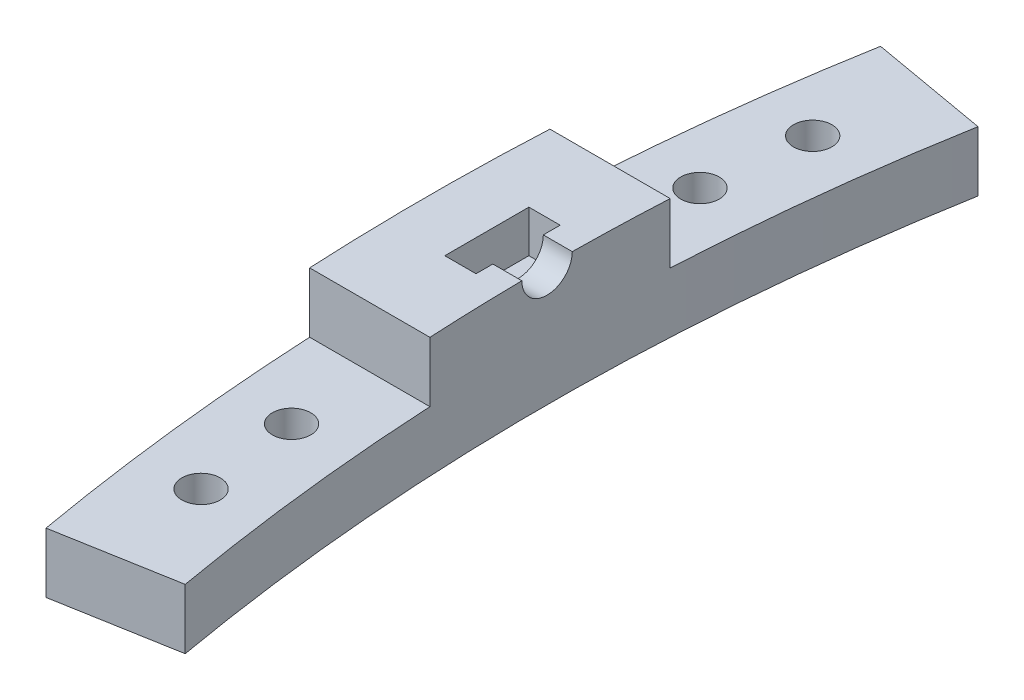
ISO-10303-21;
HEADER;
FILE_DESCRIPTION(('STEP AP214'),'2;1');
FILE_NAME('part.step','',(''),(''),'','','');
FILE_SCHEMA(('AUTOMOTIVE_DESIGN { 1 0 10303 214 1 1 1 1 }'));
ENDSEC;
DATA;
#1=APPLICATION_CONTEXT('core data for automotive mechanical design processes');
#2=APPLICATION_PROTOCOL_DEFINITION('international standard','automotive_design',2000,#1);
#3=PRODUCT_CONTEXT('',#1,'mechanical');
#4=PRODUCT('Part','Part','',(#3));
#5=PRODUCT_RELATED_PRODUCT_CATEGORY('part','',(#4));
#6=PRODUCT_DEFINITION_FORMATION('','',#4);
#7=PRODUCT_DEFINITION_CONTEXT('part definition',#1,'design');
#8=PRODUCT_DEFINITION('design','',#6,#7);
#9=PRODUCT_DEFINITION_SHAPE('','',#8);
#10=(LENGTH_UNIT() NAMED_UNIT(*) SI_UNIT(.MILLI.,.METRE.));
#11=(NAMED_UNIT(*) PLANE_ANGLE_UNIT() SI_UNIT($,.RADIAN.));
#12=(NAMED_UNIT(*) SI_UNIT($,.STERADIAN.) SOLID_ANGLE_UNIT());
#13=UNCERTAINTY_MEASURE_WITH_UNIT(LENGTH_MEASURE(1.E-05),#10,'distance_accuracy_value','');
#14=(GEOMETRIC_REPRESENTATION_CONTEXT(3) GLOBAL_UNCERTAINTY_ASSIGNED_CONTEXT((#13)) GLOBAL_UNIT_ASSIGNED_CONTEXT((#10,
#11,#12)) REPRESENTATION_CONTEXT('',''));
#15=CARTESIAN_POINT('',(0.,0.,0.));
#16=DIRECTION('',(0.,0.,1.));
#17=DIRECTION('',(1.,0.,0.));
#18=AXIS2_PLACEMENT_3D('',#15,#16,#17);
#19=CARTESIAN_POINT('',(0.,5.,0.));
#20=DIRECTION('',(0.,1.,0.));
#21=DIRECTION('',(0.,0.,1.));
#22=AXIS2_PLACEMENT_3D('',#19,#20,#21);
#23=PLANE('',#22);
#24=CARTESIAN_POINT('',(-194.25796612789,5.,-16.9953698357934));
#25=DIRECTION('',(0.,1.,0.));
#26=DIRECTION('',(0.,0.,1.));
#27=AXIS2_PLACEMENT_3D('',#24,#25,#26);
#28=CIRCLE('',#27,1.59999999999999);
#29=CARTESIAN_POINT('',(-194.25796612789,5.,-15.3953698357934));
#30=VERTEX_POINT('',#29);
#31=EDGE_CURVE('E305',#30,#30,#28,.T.);
#32=ORIENTED_EDGE('',*,*,#31,.F.);
#33=EDGE_LOOP('',(#32));
#34=FACE_BOUND('',#33,.T.);
#35=CARTESIAN_POINT('',(-193.331747967893,5.,-25.4526074829103));
#36=DIRECTION('',(0.,1.,0.));
#37=DIRECTION('',(0.,0.,1.));
#38=AXIS2_PLACEMENT_3D('',#35,#36,#37);
#39=CIRCLE('',#38,1.59999999999999);
#40=CARTESIAN_POINT('',(-193.331747967893,5.,-23.8526074829103));
#41=VERTEX_POINT('',#40);
#42=EDGE_CURVE('E309',#41,#41,#39,.T.);
#43=ORIENTED_EDGE('',*,*,#42,.F.);
#44=EDGE_LOOP('',(#43));
#45=FACE_BOUND('',#44,.T.);
#46=DIRECTION('',(-1.,0.,0.));
#47=VECTOR('',#46,1.);
#48=CARTESIAN_POINT('',(-199.749843554382,5.,-9.99999999999997));
#49=LINE('',#48,#47);
#50=CARTESIAN_POINT('',(-189.736659610103,5.,-9.99999999999997));
#51=VERTEX_POINT('',#50);
#52=CARTESIAN_POINT('',(-199.749843554382,5.,-9.99999999999997));
#53=VERTEX_POINT('',#52);
#54=EDGE_CURVE('E178',#51,#53,#49,.T.);
#55=ORIENTED_EDGE('',*,*,#54,.F.);
#56=CARTESIAN_POINT('',(0.,5.,0.));
#57=DIRECTION('',(0.,-1.,0.));
#58=DIRECTION('',(0.,0.,1.));
#59=AXIS2_PLACEMENT_3D('',#56,#57,#58);
#60=CIRCLE('',#59,190.);
#61=CARTESIAN_POINT('',(-187.11347307232,5.,-32.9931537567167));
#62=VERTEX_POINT('',#61);
#63=EDGE_CURVE('E206',#51,#62,#60,.T.);
#64=ORIENTED_EDGE('',*,*,#63,.T.);
#65=DIRECTION('',(-0.984807753012208,0.,-0.17364817766693));
#66=VECTOR('',#65,1.);
#67=CARTESIAN_POINT('',(-196.961550602442,5.,-34.729635533386));
#68=LINE('',#67,#66);
#69=CARTESIAN_POINT('',(-196.961550602442,5.,-34.729635533386));
#70=VERTEX_POINT('',#69);
#71=EDGE_CURVE('E209',#62,#70,#68,.T.);
#72=ORIENTED_EDGE('',*,*,#71,.T.);
#73=CARTESIAN_POINT('',(0.,5.,0.));
#74=DIRECTION('',(0.,1.,0.));
#75=DIRECTION('',(0.,0.,1.));
#76=AXIS2_PLACEMENT_3D('',#73,#74,#75);
#77=CIRCLE('',#76,200.);
#78=EDGE_CURVE('E201',#70,#53,#77,.T.);
#79=ORIENTED_EDGE('',*,*,#78,.T.);
#80=EDGE_LOOP('',(#55,#64,#72,#79));
#81=FACE_BOUND('',#80,.T.);
#82=ADVANCED_FACE('F32',(#34,#45,#81),#23,.T.);
#83=CARTESIAN_POINT('',(0.,5.,0.));
#84=DIRECTION('',(0.,-1.,0.));
#85=DIRECTION('',(0.,0.,-1.));
#86=AXIS2_PLACEMENT_3D('',#83,#84,#85);
#87=CYLINDRICAL_SURFACE('',#86,200.);
#88=CARTESIAN_POINT('',(0.,0.,0.));
#89=DIRECTION('',(0.,1.,0.));
#90=DIRECTION('',(0.,0.,1.));
#91=AXIS2_PLACEMENT_3D('',#88,#89,#90);
#92=CIRCLE('',#91,200.);
#93=CARTESIAN_POINT('',(-196.961550602442,0.,-34.729635533386));
#94=VERTEX_POINT('',#93);
#95=CARTESIAN_POINT('',(-196.961550602442,0.,34.7296355333861));
#96=VERTEX_POINT('',#95);
#97=EDGE_CURVE('E200',#94,#96,#92,.T.);
#98=ORIENTED_EDGE('',*,*,#97,.T.);
#99=DIRECTION('',(0.,-1.,0.));
#100=VECTOR('',#99,1.);
#101=CARTESIAN_POINT('',(-196.961550602442,5.,34.7296355333861));
#102=LINE('',#101,#100);
#103=CARTESIAN_POINT('',(-196.961550602442,5.,34.7296355333861));
#104=VERTEX_POINT('',#103);
#105=EDGE_CURVE('E228',#104,#96,#102,.T.);
#106=ORIENTED_EDGE('',*,*,#105,.F.);
#107=CARTESIAN_POINT('',(-199.749843554382,5.,10.));
#108=VERTEX_POINT('',#107);
#109=EDGE_CURVE('E204',#108,#104,#77,.T.);
#110=ORIENTED_EDGE('',*,*,#109,.F.);
#111=DIRECTION('',(0.,-1.,0.));
#112=VECTOR('',#111,1.);
#113=CARTESIAN_POINT('',(-199.749843554382,10.,10.));
#114=LINE('',#113,#112);
#115=CARTESIAN_POINT('',(-199.749843554382,10.,10.));
#116=VERTEX_POINT('',#115);
#117=EDGE_CURVE('E197',#116,#108,#114,.T.);
#118=ORIENTED_EDGE('',*,*,#117,.F.);
#119=CARTESIAN_POINT('',(0.,10.,0.));
#120=DIRECTION('',(0.,1.,0.));
#121=DIRECTION('',(0.,0.,1.));
#122=AXIS2_PLACEMENT_3D('',#119,#120,#121);
#123=CIRCLE('',#122,200.);
#124=CARTESIAN_POINT('',(-199.749843554382,10.,-9.99999999999997));
#125=VERTEX_POINT('',#124);
#126=EDGE_CURVE('E174',#125,#116,#123,.T.);
#127=ORIENTED_EDGE('',*,*,#126,.F.);
#128=DIRECTION('',(0.,-1.,0.));
#129=VECTOR('',#128,1.);
#130=CARTESIAN_POINT('',(-199.749843554382,10.,-9.99999999999997));
#131=LINE('',#130,#129);
#132=EDGE_CURVE('E184',#125,#53,#131,.T.);
#133=ORIENTED_EDGE('',*,*,#132,.T.);
#134=ORIENTED_EDGE('',*,*,#78,.F.);
#135=DIRECTION('',(0.,-1.,0.));
#136=VECTOR('',#135,1.);
#137=CARTESIAN_POINT('',(-196.961550602442,5.,-34.729635533386));
#138=LINE('',#137,#136);
#139=EDGE_CURVE('E211',#70,#94,#138,.T.);
#140=ORIENTED_EDGE('',*,*,#139,.T.);
#141=EDGE_LOOP('',(#98,#106,#110,#118,#127,#133,#134,#140));
#142=FACE_BOUND('',#141,.T.);
#143=ADVANCED_FACE('F34',(#142),#87,.T.);
#144=CARTESIAN_POINT('',(-187.11347307232,5.,32.9931537567168));
#145=DIRECTION('',(-0.17364817766693,0.,-0.984807753012208));
#146=DIRECTION('',(-0.984807753012208,0.,0.17364817766693));
#147=AXIS2_PLACEMENT_3D('',#144,#145,#146);
#148=PLANE('',#147);
#149=DIRECTION('',(0.984807753012208,0.,-0.17364817766693));
#150=VECTOR('',#149,1.);
#151=CARTESIAN_POINT('',(-187.11347307232,0.,32.9931537567168));
#152=LINE('',#151,#150);
#153=CARTESIAN_POINT('',(-187.11347307232,0.,32.9931537567167));
#154=VERTEX_POINT('',#153);
#155=EDGE_CURVE('E214',#96,#154,#152,.T.);
#156=ORIENTED_EDGE('',*,*,#155,.T.);
#157=DIRECTION('',(0.,-1.,0.));
#158=VECTOR('',#157,1.);
#159=CARTESIAN_POINT('',(-187.11347307232,5.,32.9931537567167));
#160=LINE('',#159,#158);
#161=CARTESIAN_POINT('',(-187.11347307232,5.,32.9931537567167));
#162=VERTEX_POINT('',#161);
#163=EDGE_CURVE('E225',#162,#154,#160,.T.);
#164=ORIENTED_EDGE('',*,*,#163,.F.);
#165=DIRECTION('',(0.984807753012208,0.,-0.17364817766693));
#166=VECTOR('',#165,1.);
#167=CARTESIAN_POINT('',(-187.11347307232,5.,32.9931537567168));
#168=LINE('',#167,#166);
#169=EDGE_CURVE('E203',#104,#162,#168,.T.);
#170=ORIENTED_EDGE('',*,*,#169,.F.);
#171=ORIENTED_EDGE('',*,*,#105,.T.);
#172=EDGE_LOOP('',(#156,#164,#170,#171));
#173=FACE_BOUND('',#172,.T.);
#174=ADVANCED_FACE('F294',(#173),#148,.F.);
#175=CARTESIAN_POINT('',(0.,5.,0.));
#176=DIRECTION('',(0.,-1.,0.));
#177=DIRECTION('',(0.,0.,-1.));
#178=AXIS2_PLACEMENT_3D('',#175,#176,#177);
#179=CYLINDRICAL_SURFACE('',#178,190.);
#180=CARTESIAN_POINT('',(0.,10.,0.));
#181=DIRECTION('',(0.,-1.,0.));
#182=DIRECTION('',(0.,0.,1.));
#183=AXIS2_PLACEMENT_3D('',#180,#181,#182);
#184=CIRCLE('',#183,190.);
#185=CARTESIAN_POINT('',(-189.988394382394,10.,-2.09999999999998));
#186=VERTEX_POINT('',#185);
#187=CARTESIAN_POINT('',(-189.736659610103,10.,-9.99999999999997));
#188=VERTEX_POINT('',#187);
#189=EDGE_CURVE('E180',#186,#188,#184,.T.);
#190=ORIENTED_EDGE('',*,*,#189,.F.);
#191=CARTESIAN_POINT('',(-189.988394382394,10.,-2.09999999999998));
#192=CARTESIAN_POINT('',(-189.988394227959,9.94092049843261,-2.0999996098776));
#193=CARTESIAN_POINT('',(-189.988421974904,9.88186930357488,-2.09750530246308));
#194=CARTESIAN_POINT('',(-189.98853163464,9.76418948312831,-2.08755450800337));
#195=CARTESIAN_POINT('',(-189.988613544826,9.70556083734857,-2.08009825966782));
#196=CARTESIAN_POINT('',(-189.98893772329,9.53103530343177,-2.05035645947468));
#197=CARTESIAN_POINT('',(-189.989258449708,9.41630756947076,-2.02069766263316));
#198=CARTESIAN_POINT('',(-189.990073529029,9.19346545440071,-1.94254204444735));
#199=CARTESIAN_POINT('',(-189.990567962272,9.08535416069951,-1.89403650512828));
#200=CARTESIAN_POINT('',(-189.991674529232,8.87881464879999,-1.77957090007642));
#201=CARTESIAN_POINT('',(-189.992286639926,8.78038454221302,-1.71361424761393));
#202=CARTESIAN_POINT('',(-189.993559679214,8.59599146126294,-1.56611091240725));
#203=CARTESIAN_POINT('',(-189.99422061074,8.51002923650333,-1.48456329297377));
#204=CARTESIAN_POINT('',(-189.995516855752,8.35300091067911,-1.30818090271072));
#205=CARTESIAN_POINT('',(-189.996152165323,8.28193708010645,-1.2133441103009));
#206=CARTESIAN_POINT('',(-189.997325416957,8.15674222755364,-1.01308687365182));
#207=CARTESIAN_POINT('',(-189.997863360826,8.10261089162755,-0.907666625688635));
#208=CARTESIAN_POINT('',(-189.998781212844,8.0128187019638,-0.689240622001089));
#209=CARTESIAN_POINT('',(-189.999161131142,7.97715666203168,-0.576235353952964));
#210=CARTESIAN_POINT('',(-189.999720144154,7.92531109579345,-0.345843560426048));
#211=CARTESIAN_POINT('',(-189.999899243073,7.90912716158071,-0.228457126749838));
#212=CARTESIAN_POINT('',(-190.000036441481,7.89669589106343,0.00736951001153992));
#213=CARTESIAN_POINT('',(-189.999994535953,7.90044900732404,0.125809736956578));
#214=CARTESIAN_POINT('',(-189.999694446697,7.92778554965518,0.360372418675998));
#215=CARTESIAN_POINT('',(-189.999436274567,7.95136791237589,0.476494997393191));
#216=CARTESIAN_POINT('',(-189.998732772716,8.01769183925002,0.70313236497099));
#217=CARTESIAN_POINT('',(-189.998287443562,8.06043334542175,0.813647170801383));
#218=CARTESIAN_POINT('',(-189.997259802801,8.16386446009074,1.0259378200559));
#219=CARTESIAN_POINT('',(-189.996677484562,8.22455493736005,1.12771324016562));
#220=CARTESIAN_POINT('',(-189.995441554318,8.36215754926062,1.31962579459902));
#221=CARTESIAN_POINT('',(-189.994787945795,8.43906889162157,1.40976349699333));
#222=CARTESIAN_POINT('',(-189.993483138824,8.60692334249288,1.57584165422156));
#223=CARTESIAN_POINT('',(-189.992831940186,8.69786531728204,1.65178325505157));
#224=CARTESIAN_POINT('',(-189.991605103621,8.89124366769176,1.78734519740775));
#225=CARTESIAN_POINT('',(-189.991029489766,8.99368368595505,1.84696034593228));
#226=CARTESIAN_POINT('',(-189.990018661754,9.20716253174667,1.94817412941855));
#227=CARTESIAN_POINT('',(-189.989583533301,9.31820655722686,1.98976177177155));
#228=CARTESIAN_POINT('',(-189.988903887373,9.54561454036825,2.05363996543016));
#229=CARTESIAN_POINT('',(-189.98865907884,9.66197008539181,2.07595998863416));
#230=CARTESIAN_POINT('',(-189.98847996913,9.81591594191257,2.09224359247267));
#231=CARTESIAN_POINT('',(-189.98844789042,9.85270495166606,2.09515378108205));
#232=CARTESIAN_POINT('',(-189.98840512571,9.92632434119294,2.09902932940879));
#233=CARTESIAN_POINT('',(-189.988394404427,9.96315455199409,2.09999789674788));
#234=CARTESIAN_POINT('',(-189.988394382394,10.,2.10000000000002));
#235=B_SPLINE_CURVE_WITH_KNOTS('',3,(#191,#192,#193,#194,#195,#196,#197,#198,#199,#200,#201,
#202,#203,#204,#205,#206,#207,#208,#209,#210,#211,#212,#213,#214,#215,#216,#217,#218,#219,#220,
#221,#222,#223,#224,#225,#226,#227,#228,#229,#230,#231,#232,#233,#234),.UNSPECIFIED.,.F.,.F.,(4,
2,2,2,2,2,2,2,2,2,2,2,2,2,2,2,2,2,2,2,2,4),(0.,0.177129634560392,0.354250748362896,
0.707926531135292,1.06176610955418,1.41553653144156,1.76932821417535,2.12317377507689,
2.47701277492695,2.83082904657275,3.18463790853941,3.53845480189693,3.89225272291795,
4.24604957324059,4.59986355095913,4.95366025145997,5.30742837898317,5.6613089002078,
6.01540490418796,6.36895831557149,6.47963445290425,6.59012759846504),.UNSPECIFIED.);
#236=CARTESIAN_POINT('',(-189.988394382394,10.,2.10000000000002));
#237=VERTEX_POINT('',#236);
#238=EDGE_CURVE('E166',#186,#237,#235,.T.);
#239=ORIENTED_EDGE('',*,*,#238,.T.);
#240=CARTESIAN_POINT('',(-189.736659610103,10.,9.99999999999993));
#241=VERTEX_POINT('',#240);
#242=EDGE_CURVE('E144',#241,#237,#184,.T.);
#243=ORIENTED_EDGE('',*,*,#242,.F.);
#244=DIRECTION('',(0.,-1.,0.));
#245=VECTOR('',#244,1.);
#246=CARTESIAN_POINT('',(-189.736659610103,10.,9.99999999999993));
#247=LINE('',#246,#245);
#248=CARTESIAN_POINT('',(-189.736659610103,5.,9.99999999999993));
#249=VERTEX_POINT('',#248);
#250=EDGE_CURVE('E194',#241,#249,#247,.T.);
#251=ORIENTED_EDGE('',*,*,#250,.T.);
#252=EDGE_CURVE('E207',#162,#249,#60,.T.);
#253=ORIENTED_EDGE('',*,*,#252,.F.);
#254=ORIENTED_EDGE('',*,*,#163,.T.);
#255=CARTESIAN_POINT('',(0.,0.,0.));
#256=DIRECTION('',(0.,-1.,0.));
#257=DIRECTION('',(0.,0.,1.));
#258=AXIS2_PLACEMENT_3D('',#255,#256,#257);
#259=CIRCLE('',#258,190.);
#260=CARTESIAN_POINT('',(-187.11347307232,0.,-32.9931537567167));
#261=VERTEX_POINT('',#260);
#262=EDGE_CURVE('E216',#154,#261,#259,.T.);
#263=ORIENTED_EDGE('',*,*,#262,.T.);
#264=DIRECTION('',(0.,-1.,0.));
#265=VECTOR('',#264,1.);
#266=CARTESIAN_POINT('',(-187.11347307232,5.,-32.9931537567167));
#267=LINE('',#266,#265);
#268=EDGE_CURVE('E222',#62,#261,#267,.T.);
#269=ORIENTED_EDGE('',*,*,#268,.F.);
#270=ORIENTED_EDGE('',*,*,#63,.F.);
#271=DIRECTION('',(0.,-1.,0.));
#272=VECTOR('',#271,1.);
#273=CARTESIAN_POINT('',(-189.736659610103,10.,-9.99999999999997));
#274=LINE('',#273,#272);
#275=EDGE_CURVE('E191',#188,#51,#274,.T.);
#276=ORIENTED_EDGE('',*,*,#275,.F.);
#277=EDGE_LOOP('',(#190,#239,#243,#251,#253,#254,#263,#269,#270,#276));
#278=FACE_BOUND('',#277,.T.);
#279=ADVANCED_FACE('F247',(#278),#179,.F.);
#280=CARTESIAN_POINT('',(-196.961550602442,5.,-34.729635533386));
#281=DIRECTION('',(-0.17364817766693,0.,0.984807753012208));
#282=DIRECTION('',(0.984807753012208,0.,0.17364817766693));
#283=AXIS2_PLACEMENT_3D('',#280,#281,#282);
#284=PLANE('',#283);
#285=DIRECTION('',(-0.984807753012208,0.,-0.17364817766693));
#286=VECTOR('',#285,1.);
#287=CARTESIAN_POINT('',(-196.961550602442,0.,-34.729635533386));
#288=LINE('',#287,#286);
#289=EDGE_CURVE('E218',#261,#94,#288,.T.);
#290=ORIENTED_EDGE('',*,*,#289,.T.);
#291=ORIENTED_EDGE('',*,*,#139,.F.);
#292=ORIENTED_EDGE('',*,*,#71,.F.);
#293=ORIENTED_EDGE('',*,*,#268,.T.);
#294=EDGE_LOOP('',(#290,#291,#292,#293));
#295=FACE_BOUND('',#294,.T.);
#296=ADVANCED_FACE('F285',(#295),#284,.F.);
#297=CARTESIAN_POINT('',(-194.25796612789,5.,16.9953698357934));
#298=DIRECTION('',(0.,1.,0.));
#299=DIRECTION('',(0.,0.,1.));
#300=AXIS2_PLACEMENT_3D('',#297,#298,#299);
#301=CIRCLE('',#300,1.59999999999999);
#302=CARTESIAN_POINT('',(-194.25796612789,5.,18.5953698357934));
#303=VERTEX_POINT('',#302);
#304=EDGE_CURVE('E444',#303,#303,#301,.T.);
#305=ORIENTED_EDGE('',*,*,#304,.F.);
#306=EDGE_LOOP('',(#305));
#307=FACE_BOUND('',#306,.T.);
#308=CARTESIAN_POINT('',(-193.331747967893,5.,25.4526074829103));
#309=DIRECTION('',(0.,1.,0.));
#310=DIRECTION('',(0.,0.,1.));
#311=AXIS2_PLACEMENT_3D('',#308,#309,#310);
#312=CIRCLE('',#311,1.59999999999999);
#313=CARTESIAN_POINT('',(-193.331747967893,5.,27.0526074829102));
#314=VERTEX_POINT('',#313);
#315=EDGE_CURVE('E450',#314,#314,#312,.T.);
#316=ORIENTED_EDGE('',*,*,#315,.F.);
#317=EDGE_LOOP('',(#316));
#318=FACE_BOUND('',#317,.T.);
#319=DIRECTION('',(1.,0.,0.));
#320=VECTOR('',#319,1.);
#321=CARTESIAN_POINT('',(-199.749843554382,5.,10.));
#322=LINE('',#321,#320);
#323=EDGE_CURVE('E172',#108,#249,#322,.T.);
#324=ORIENTED_EDGE('',*,*,#323,.F.);
#325=ORIENTED_EDGE('',*,*,#109,.T.);
#326=ORIENTED_EDGE('',*,*,#169,.T.);
#327=ORIENTED_EDGE('',*,*,#252,.T.);
#328=EDGE_LOOP('',(#324,#325,#326,#327));
#329=FACE_BOUND('',#328,.T.);
#330=ADVANCED_FACE('F282',(#307,#318,#329),#23,.T.);
#331=CARTESIAN_POINT('',(0.,0.,0.));
#332=DIRECTION('',(0.,1.,0.));
#333=DIRECTION('',(0.,0.,1.));
#334=AXIS2_PLACEMENT_3D('',#331,#332,#333);
#335=PLANE('',#334);
#336=CARTESIAN_POINT('',(-194.25796612789,0.,-16.9953698357934));
#337=DIRECTION('',(0.,1.,0.));
#338=DIRECTION('',(0.,0.,1.));
#339=AXIS2_PLACEMENT_3D('',#336,#337,#338);
#340=CIRCLE('',#339,1.59999999999999);
#341=CARTESIAN_POINT('',(-194.25796612789,0.,-15.3953698357934));
#342=VERTEX_POINT('',#341);
#343=EDGE_CURVE('E436',#342,#342,#340,.T.);
#344=ORIENTED_EDGE('',*,*,#343,.T.);
#345=EDGE_LOOP('',(#344));
#346=FACE_BOUND('',#345,.T.);
#347=CARTESIAN_POINT('',(-193.331747967893,0.,-25.4526074829103));
#348=DIRECTION('',(0.,1.,0.));
#349=DIRECTION('',(0.,0.,1.));
#350=AXIS2_PLACEMENT_3D('',#347,#348,#349);
#351=CIRCLE('',#350,1.59999999999999);
#352=CARTESIAN_POINT('',(-193.331747967893,0.,-23.8526074829103));
#353=VERTEX_POINT('',#352);
#354=EDGE_CURVE('E441',#353,#353,#351,.T.);
#355=ORIENTED_EDGE('',*,*,#354,.T.);
#356=EDGE_LOOP('',(#355));
#357=FACE_BOUND('',#356,.T.);
#358=CARTESIAN_POINT('',(-194.25796612789,0.,16.9953698357934));
#359=DIRECTION('',(0.,1.,0.));
#360=DIRECTION('',(0.,0.,1.));
#361=AXIS2_PLACEMENT_3D('',#358,#359,#360);
#362=CIRCLE('',#361,1.59999999999999);
#363=CARTESIAN_POINT('',(-194.25796612789,0.,18.5953698357934));
#364=VERTEX_POINT('',#363);
#365=EDGE_CURVE('E447',#364,#364,#362,.T.);
#366=ORIENTED_EDGE('',*,*,#365,.T.);
#367=EDGE_LOOP('',(#366));
#368=FACE_BOUND('',#367,.T.);
#369=CARTESIAN_POINT('',(-193.331747967893,0.,25.4526074829103));
#370=DIRECTION('',(0.,1.,0.));
#371=DIRECTION('',(0.,0.,1.));
#372=AXIS2_PLACEMENT_3D('',#369,#370,#371);
#373=CIRCLE('',#372,1.59999999999999);
#374=CARTESIAN_POINT('',(-193.331747967893,0.,27.0526074829102));
#375=VERTEX_POINT('',#374);
#376=EDGE_CURVE('E138',#375,#375,#373,.T.);
#377=ORIENTED_EDGE('',*,*,#376,.T.);
#378=EDGE_LOOP('',(#377));
#379=FACE_BOUND('',#378,.T.);
#380=ORIENTED_EDGE('',*,*,#97,.F.);
#381=ORIENTED_EDGE('',*,*,#289,.F.);
#382=ORIENTED_EDGE('',*,*,#262,.F.);
#383=ORIENTED_EDGE('',*,*,#155,.F.);
#384=EDGE_LOOP('',(#380,#381,#382,#383));
#385=FACE_BOUND('',#384,.T.);
#386=ADVANCED_FACE('F280',(#346,#357,#368,#379,#385),#335,.F.);
#387=CARTESIAN_POINT('',(-199.749843554382,10.,10.));
#388=DIRECTION('',(0.,0.,-1.));
#389=DIRECTION('',(-1.,0.,0.));
#390=AXIS2_PLACEMENT_3D('',#387,#388,#389);
#391=PLANE('',#390);
#392=ORIENTED_EDGE('',*,*,#323,.T.);
#393=ORIENTED_EDGE('',*,*,#250,.F.);
#394=DIRECTION('',(1.,0.,0.));
#395=VECTOR('',#394,1.);
#396=CARTESIAN_POINT('',(-199.749843554382,10.,10.));
#397=LINE('',#396,#395);
#398=EDGE_CURVE('E177',#116,#241,#397,.T.);
#399=ORIENTED_EDGE('',*,*,#398,.F.);
#400=ORIENTED_EDGE('',*,*,#117,.T.);
#401=EDGE_LOOP('',(#392,#393,#399,#400));
#402=FACE_BOUND('',#401,.T.);
#403=ADVANCED_FACE('F276',(#402),#391,.F.);
#404=CARTESIAN_POINT('',(-199.749843554382,10.,-9.99999999999997));
#405=DIRECTION('',(0.,0.,1.));
#406=DIRECTION('',(1.,0.,0.));
#407=AXIS2_PLACEMENT_3D('',#404,#405,#406);
#408=PLANE('',#407);
#409=ORIENTED_EDGE('',*,*,#54,.T.);
#410=ORIENTED_EDGE('',*,*,#132,.F.);
#411=DIRECTION('',(-1.,0.,0.));
#412=VECTOR('',#411,1.);
#413=CARTESIAN_POINT('',(-199.749843554382,10.,-9.99999999999997));
#414=LINE('',#413,#412);
#415=EDGE_CURVE('E182',#188,#125,#414,.T.);
#416=ORIENTED_EDGE('',*,*,#415,.F.);
#417=ORIENTED_EDGE('',*,*,#275,.T.);
#418=EDGE_LOOP('',(#409,#410,#416,#417));
#419=FACE_BOUND('',#418,.T.);
#420=ADVANCED_FACE('F273',(#419),#408,.F.);
#421=CARTESIAN_POINT('',(0.,10.,0.));
#422=DIRECTION('',(0.,1.,0.));
#423=DIRECTION('',(0.,0.,1.));
#424=AXIS2_PLACEMENT_3D('',#421,#422,#423);
#425=PLANE('',#424);
#426=DIRECTION('',(-1.,0.,0.));
#427=VECTOR('',#426,1.);
#428=CARTESIAN_POINT('',(-187.11347307232,10.,-2.09999999999998));
#429=LINE('',#428,#427);
#430=CARTESIAN_POINT('',(-192.4,10.,-2.09999999999998));
#431=VERTEX_POINT('',#430);
#432=EDGE_CURVE('E47',#186,#431,#429,.T.);
#433=ORIENTED_EDGE('',*,*,#432,.F.);
#434=ORIENTED_EDGE('',*,*,#189,.T.);
#435=ORIENTED_EDGE('',*,*,#415,.T.);
#436=ORIENTED_EDGE('',*,*,#126,.T.);
#437=ORIENTED_EDGE('',*,*,#398,.T.);
#438=ORIENTED_EDGE('',*,*,#242,.T.);
#439=DIRECTION('',(-1.,0.,0.));
#440=VECTOR('',#439,1.);
#441=CARTESIAN_POINT('',(-187.11347307232,10.,2.10000000000002));
#442=LINE('',#441,#440);
#443=CARTESIAN_POINT('',(-192.4,10.,2.10000000000002));
#444=VERTEX_POINT('',#443);
#445=EDGE_CURVE('E134',#444,#237,#442,.F.);
#446=ORIENTED_EDGE('',*,*,#445,.F.);
#447=DIRECTION('',(0.,0.,-1.));
#448=VECTOR('',#447,1.);
#449=CARTESIAN_POINT('',(-192.4,10.,0.));
#450=LINE('',#449,#448);
#451=CARTESIAN_POINT('',(-192.4,10.,3.5));
#452=VERTEX_POINT('',#451);
#453=EDGE_CURVE('E11',#452,#444,#450,.T.);
#454=ORIENTED_EDGE('',*,*,#453,.F.);
#455=DIRECTION('',(1.,0.,0.));
#456=VECTOR('',#455,1.);
#457=CARTESIAN_POINT('',(0.,10.,3.5));
#458=LINE('',#457,#456);
#459=CARTESIAN_POINT('',(-195.,10.,3.5));
#460=VERTEX_POINT('',#459);
#461=EDGE_CURVE('E232',#460,#452,#458,.T.);
#462=ORIENTED_EDGE('',*,*,#461,.F.);
#463=DIRECTION('',(0.,0.,-1.));
#464=VECTOR('',#463,1.);
#465=CARTESIAN_POINT('',(-195.,10.,0.));
#466=LINE('',#465,#464);
#467=CARTESIAN_POINT('',(-195.,10.,-3.5));
#468=VERTEX_POINT('',#467);
#469=EDGE_CURVE('E55',#460,#468,#466,.T.);
#470=ORIENTED_EDGE('',*,*,#469,.T.);
#471=DIRECTION('',(-1.,0.,0.));
#472=VECTOR('',#471,1.);
#473=CARTESIAN_POINT('',(0.,10.,-3.5));
#474=LINE('',#473,#472);
#475=CARTESIAN_POINT('',(-192.4,10.,-3.5));
#476=VERTEX_POINT('',#475);
#477=EDGE_CURVE('E233',#476,#468,#474,.T.);
#478=ORIENTED_EDGE('',*,*,#477,.F.);
#479=EDGE_CURVE('E40',#431,#476,#450,.T.);
#480=ORIENTED_EDGE('',*,*,#479,.F.);
#481=EDGE_LOOP('',(#433,#434,#435,#436,#437,#438,#446,#454,#462,#470,#478,#480));
#482=FACE_BOUND('',#481,.T.);
#483=ADVANCED_FACE('F142',(#482),#425,.T.);
#484=CARTESIAN_POINT('',(-192.4,13.5,-3.5));
#485=DIRECTION('',(0.,0.,-1.));
#486=DIRECTION('',(0.,1.,0.));
#487=AXIS2_PLACEMENT_3D('',#484,#485,#486);
#488=PLANE('',#487);
#489=ORIENTED_EDGE('',*,*,#477,.T.);
#490=DIRECTION('',(0.,-1.,0.));
#491=VECTOR('',#490,1.);
#492=CARTESIAN_POINT('',(-195.,13.5,-3.5));
#493=LINE('',#492,#491);
#494=CARTESIAN_POINT('',(-195.,6.5,-3.5));
#495=VERTEX_POINT('',#494);
#496=EDGE_CURVE('E163',#468,#495,#493,.T.);
#497=ORIENTED_EDGE('',*,*,#496,.T.);
#498=DIRECTION('',(-1.,0.,0.));
#499=VECTOR('',#498,1.);
#500=CARTESIAN_POINT('',(-192.4,6.5,-3.5));
#501=LINE('',#500,#499);
#502=CARTESIAN_POINT('',(-192.4,6.5,-3.5));
#503=VERTEX_POINT('',#502);
#504=EDGE_CURVE('E154',#503,#495,#501,.T.);
#505=ORIENTED_EDGE('',*,*,#504,.F.);
#506=DIRECTION('',(0.,-1.,0.));
#507=VECTOR('',#506,1.);
#508=CARTESIAN_POINT('',(-192.4,13.5,-3.5));
#509=LINE('',#508,#507);
#510=EDGE_CURVE('E159',#476,#503,#509,.T.);
#511=ORIENTED_EDGE('',*,*,#510,.F.);
#512=EDGE_LOOP('',(#489,#497,#505,#511));
#513=FACE_BOUND('',#512,.T.);
#514=ADVANCED_FACE('F238',(#513),#488,.F.);
#515=CARTESIAN_POINT('',(-192.4,13.5,3.5));
#516=DIRECTION('',(0.,0.,1.));
#517=DIRECTION('',(0.,-1.,0.));
#518=AXIS2_PLACEMENT_3D('',#515,#516,#517);
#519=PLANE('',#518);
#520=ORIENTED_EDGE('',*,*,#461,.T.);
#521=DIRECTION('',(0.,1.,0.));
#522=VECTOR('',#521,1.);
#523=CARTESIAN_POINT('',(-192.4,13.5,3.5));
#524=LINE('',#523,#522);
#525=CARTESIAN_POINT('',(-192.4,6.5,3.5));
#526=VERTEX_POINT('',#525);
#527=EDGE_CURVE('E150',#526,#452,#524,.T.);
#528=ORIENTED_EDGE('',*,*,#527,.F.);
#529=DIRECTION('',(-1.,0.,0.));
#530=VECTOR('',#529,1.);
#531=CARTESIAN_POINT('',(-192.4,6.5,3.5));
#532=LINE('',#531,#530);
#533=CARTESIAN_POINT('',(-195.,6.5,3.5));
#534=VERTEX_POINT('',#533);
#535=EDGE_CURVE('E157',#526,#534,#532,.T.);
#536=ORIENTED_EDGE('',*,*,#535,.T.);
#537=DIRECTION('',(0.,1.,0.));
#538=VECTOR('',#537,1.);
#539=CARTESIAN_POINT('',(-195.,13.5,3.5));
#540=LINE('',#539,#538);
#541=EDGE_CURVE('E169',#534,#460,#540,.T.);
#542=ORIENTED_EDGE('',*,*,#541,.T.);
#543=EDGE_LOOP('',(#520,#528,#536,#542));
#544=FACE_BOUND('',#543,.T.);
#545=ADVANCED_FACE('F263',(#544),#519,.F.);
#546=CARTESIAN_POINT('',(-192.4,6.5,3.5));
#547=DIRECTION('',(0.,-1.,0.));
#548=DIRECTION('',(0.,0.,-1.));
#549=AXIS2_PLACEMENT_3D('',#546,#547,#548);
#550=PLANE('',#549);
#551=DIRECTION('',(0.,0.,1.));
#552=VECTOR('',#551,1.);
#553=CARTESIAN_POINT('',(-195.,6.5,3.5));
#554=LINE('',#553,#552);
#555=EDGE_CURVE('E165',#495,#534,#554,.T.);
#556=ORIENTED_EDGE('',*,*,#555,.T.);
#557=ORIENTED_EDGE('',*,*,#535,.F.);
#558=DIRECTION('',(0.,0.,1.));
#559=VECTOR('',#558,1.);
#560=CARTESIAN_POINT('',(-192.4,6.5,3.5));
#561=LINE('',#560,#559);
#562=EDGE_CURVE('E152',#503,#526,#561,.T.);
#563=ORIENTED_EDGE('',*,*,#562,.F.);
#564=ORIENTED_EDGE('',*,*,#504,.T.);
#565=EDGE_LOOP('',(#556,#557,#563,#564));
#566=FACE_BOUND('',#565,.T.);
#567=ADVANCED_FACE('F259',(#566),#550,.F.);
#568=CARTESIAN_POINT('',(-192.4,0.,0.));
#569=DIRECTION('',(1.,0.,0.));
#570=DIRECTION('',(0.,0.,-1.));
#571=AXIS2_PLACEMENT_3D('',#568,#569,#570);
#572=PLANE('',#571);
#573=ORIENTED_EDGE('',*,*,#453,.T.);
#574=CARTESIAN_POINT('',(-192.4,10.,0.));
#575=DIRECTION('',(1.,0.,0.));
#576=DIRECTION('',(0.,0.,-1.));
#577=AXIS2_PLACEMENT_3D('',#574,#575,#576);
#578=CIRCLE('',#577,2.1);
#579=EDGE_CURVE('E131',#444,#431,#578,.T.);
#580=ORIENTED_EDGE('',*,*,#579,.T.);
#581=ORIENTED_EDGE('',*,*,#479,.T.);
#582=ORIENTED_EDGE('',*,*,#510,.T.);
#583=ORIENTED_EDGE('',*,*,#562,.T.);
#584=ORIENTED_EDGE('',*,*,#527,.T.);
#585=EDGE_LOOP('',(#573,#580,#581,#582,#583,#584));
#586=FACE_BOUND('',#585,.T.);
#587=ADVANCED_FACE('F147',(#586),#572,.F.);
#588=CARTESIAN_POINT('',(-195.,0.,0.));
#589=DIRECTION('',(1.,0.,0.));
#590=DIRECTION('',(0.,0.,-1.));
#591=AXIS2_PLACEMENT_3D('',#588,#589,#590);
#592=PLANE('',#591);
#593=ORIENTED_EDGE('',*,*,#496,.F.);
#594=ORIENTED_EDGE('',*,*,#469,.F.);
#595=ORIENTED_EDGE('',*,*,#541,.F.);
#596=ORIENTED_EDGE('',*,*,#555,.F.);
#597=EDGE_LOOP('',(#593,#594,#595,#596));
#598=FACE_BOUND('',#597,.T.);
#599=ADVANCED_FACE('F255',(#598),#592,.T.);
#600=CARTESIAN_POINT('',(-187.11347307232,10.,0.));
#601=DIRECTION('',(-1.,0.,0.));
#602=DIRECTION('',(0.,0.,1.));
#603=AXIS2_PLACEMENT_3D('',#600,#601,#602);
#604=CYLINDRICAL_SURFACE('',#603,2.1);
#605=ORIENTED_EDGE('',*,*,#432,.T.);
#606=ORIENTED_EDGE('',*,*,#579,.F.);
#607=ORIENTED_EDGE('',*,*,#445,.T.);
#608=ORIENTED_EDGE('',*,*,#238,.F.);
#609=EDGE_LOOP('',(#605,#606,#607,#608));
#610=FACE_BOUND('',#609,.T.);
#611=ADVANCED_FACE('F133',(#610),#604,.F.);
#612=CARTESIAN_POINT('',(-193.331747967893,5.,25.4526074829103));
#613=DIRECTION('',(0.,1.,0.));
#614=DIRECTION('',(0.,0.,1.));
#615=AXIS2_PLACEMENT_3D('',#612,#613,#614);
#616=CYLINDRICAL_SURFACE('',#615,1.59999999999999);
#617=ORIENTED_EDGE('',*,*,#376,.F.);
#618=EDGE_LOOP('',(#617));
#619=FACE_BOUND('',#618,.T.);
#620=ORIENTED_EDGE('',*,*,#315,.T.);
#621=EDGE_LOOP('',(#620));
#622=FACE_BOUND('',#621,.T.);
#623=ADVANCED_FACE('F254',(#619,#622),#616,.F.);
#624=CARTESIAN_POINT('',(-194.25796612789,5.,16.9953698357934));
#625=DIRECTION('',(0.,1.,0.));
#626=DIRECTION('',(0.,0.,1.));
#627=AXIS2_PLACEMENT_3D('',#624,#625,#626);
#628=CYLINDRICAL_SURFACE('',#627,1.59999999999999);
#629=ORIENTED_EDGE('',*,*,#365,.F.);
#630=EDGE_LOOP('',(#629));
#631=FACE_BOUND('',#630,.T.);
#632=ORIENTED_EDGE('',*,*,#304,.T.);
#633=EDGE_LOOP('',(#632));
#634=FACE_BOUND('',#633,.T.);
#635=ADVANCED_FACE('F401',(#631,#634),#628,.F.);
#636=CARTESIAN_POINT('',(-193.331747967893,5.,-25.4526074829103));
#637=DIRECTION('',(0.,1.,0.));
#638=DIRECTION('',(0.,0.,1.));
#639=AXIS2_PLACEMENT_3D('',#636,#637,#638);
#640=CYLINDRICAL_SURFACE('',#639,1.59999999999999);
#641=ORIENTED_EDGE('',*,*,#354,.F.);
#642=EDGE_LOOP('',(#641));
#643=FACE_BOUND('',#642,.T.);
#644=ORIENTED_EDGE('',*,*,#42,.T.);
#645=EDGE_LOOP('',(#644));
#646=FACE_BOUND('',#645,.T.);
#647=ADVANCED_FACE('F410',(#643,#646),#640,.F.);
#648=CARTESIAN_POINT('',(-194.25796612789,5.,-16.9953698357934));
#649=DIRECTION('',(0.,1.,0.));
#650=DIRECTION('',(0.,0.,1.));
#651=AXIS2_PLACEMENT_3D('',#648,#649,#650);
#652=CYLINDRICAL_SURFACE('',#651,1.59999999999999);
#653=ORIENTED_EDGE('',*,*,#343,.F.);
#654=EDGE_LOOP('',(#653));
#655=FACE_BOUND('',#654,.T.);
#656=ORIENTED_EDGE('',*,*,#31,.T.);
#657=EDGE_LOOP('',(#656));
#658=FACE_BOUND('',#657,.T.);
#659=ADVANCED_FACE('F419',(#655,#658),#652,.F.);
#660=CLOSED_SHELL('',(#82,#143,#174,#279,#296,#330,#386,#403,#420,#483,#514,#545,#567,#587,#599,
#611,#623,#635,#647,#659));
#661=MANIFOLD_SOLID_BREP('B2',#660);
#662=ADVANCED_BREP_SHAPE_REPRESENTATION('',(#18,#661),#14);
#663=SHAPE_DEFINITION_REPRESENTATION(#9,#662);
ENDSEC;
END-ISO-10303-21;
